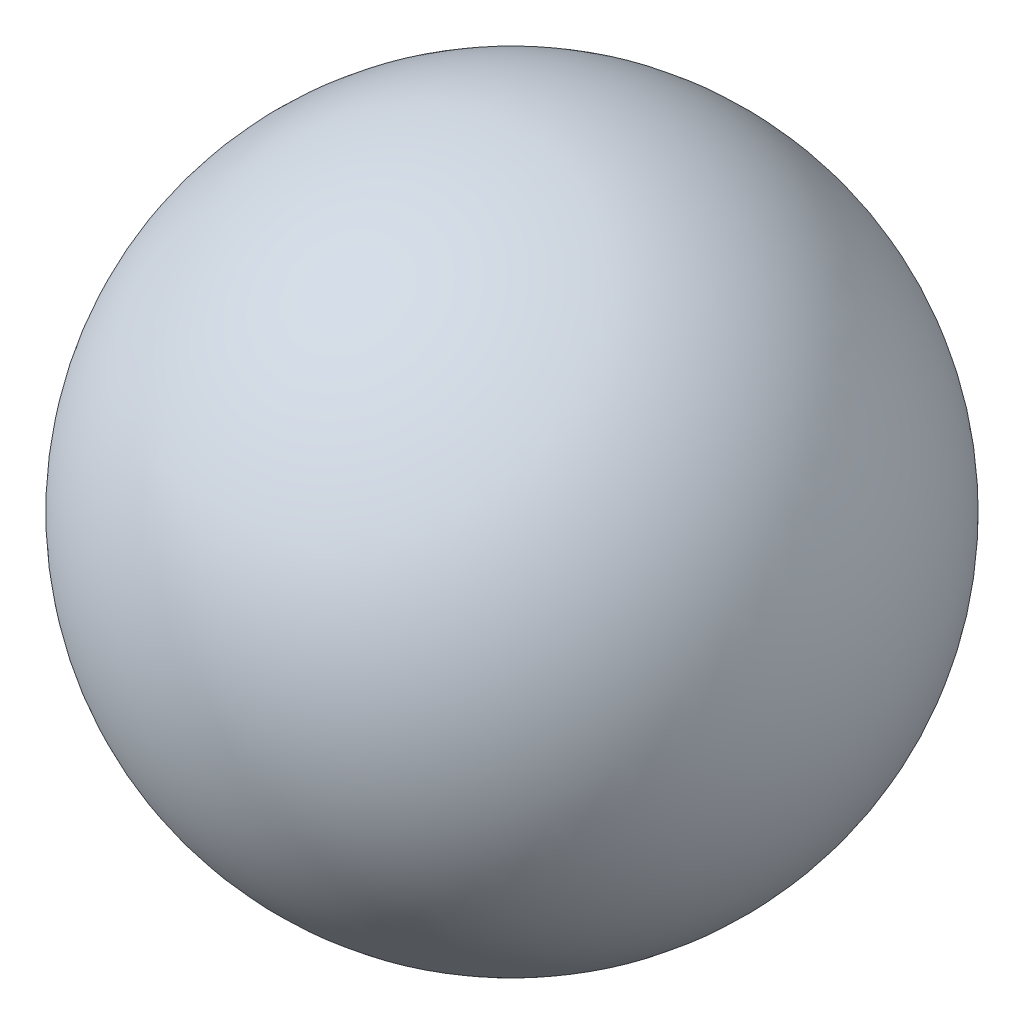
ISO-10303-21;
HEADER;
FILE_DESCRIPTION(('STEP AP214'),'2;1');
FILE_NAME('part.step','',(''),(''),'','','');
FILE_SCHEMA(('AUTOMOTIVE_DESIGN { 1 0 10303 214 1 1 1 1 }'));
ENDSEC;
DATA;
#1=APPLICATION_CONTEXT('core data for automotive mechanical design processes');
#2=APPLICATION_PROTOCOL_DEFINITION('international standard','automotive_design',2000,#1);
#3=PRODUCT_CONTEXT('',#1,'mechanical');
#4=PRODUCT('Part','Part','',(#3));
#5=PRODUCT_RELATED_PRODUCT_CATEGORY('part','',(#4));
#6=PRODUCT_DEFINITION_FORMATION('','',#4);
#7=PRODUCT_DEFINITION_CONTEXT('part definition',#1,'design');
#8=PRODUCT_DEFINITION('design','',#6,#7);
#9=PRODUCT_DEFINITION_SHAPE('','',#8);
#10=(LENGTH_UNIT() NAMED_UNIT(*) SI_UNIT(.MILLI.,.METRE.));
#11=(NAMED_UNIT(*) PLANE_ANGLE_UNIT() SI_UNIT($,.RADIAN.));
#12=(NAMED_UNIT(*) SI_UNIT($,.STERADIAN.) SOLID_ANGLE_UNIT());
#13=UNCERTAINTY_MEASURE_WITH_UNIT(LENGTH_MEASURE(1.E-05),#10,'distance_accuracy_value','');
#14=(GEOMETRIC_REPRESENTATION_CONTEXT(3) GLOBAL_UNCERTAINTY_ASSIGNED_CONTEXT((#13)) GLOBAL_UNIT_ASSIGNED_CONTEXT((#10,
#11,#12)) REPRESENTATION_CONTEXT('',''));
#15=CARTESIAN_POINT('',(0.,0.,0.));
#16=DIRECTION('',(0.,0.,1.));
#17=DIRECTION('',(1.,0.,0.));
#18=AXIS2_PLACEMENT_3D('',#15,#16,#17);
#19=CARTESIAN_POINT('',(0.,0.,0.));
#20=DIRECTION('',(0.,-1.,0.));
#21=DIRECTION('',(-1.,0.,0.));
#22=AXIS2_PLACEMENT_3D('',#19,#20,#21);
#23=SPHERICAL_SURFACE('',#22,2.75);
#24=CARTESIAN_POINT('',(0.,-2.75,0.));
#25=VERTEX_POINT('',#24);
#26=VERTEX_LOOP('',#25);
#27=FACE_BOUND('',#26,.T.);
#28=ADVANCED_FACE('F33',(#27),#23,.T.);
#29=CLOSED_SHELL('',(#28));
#30=MANIFOLD_SOLID_BREP('B2',#29);
#31=ADVANCED_BREP_SHAPE_REPRESENTATION('',(#18,#30),#14);
#32=SHAPE_DEFINITION_REPRESENTATION(#9,#31);
ENDSEC;
END-ISO-10303-21;
